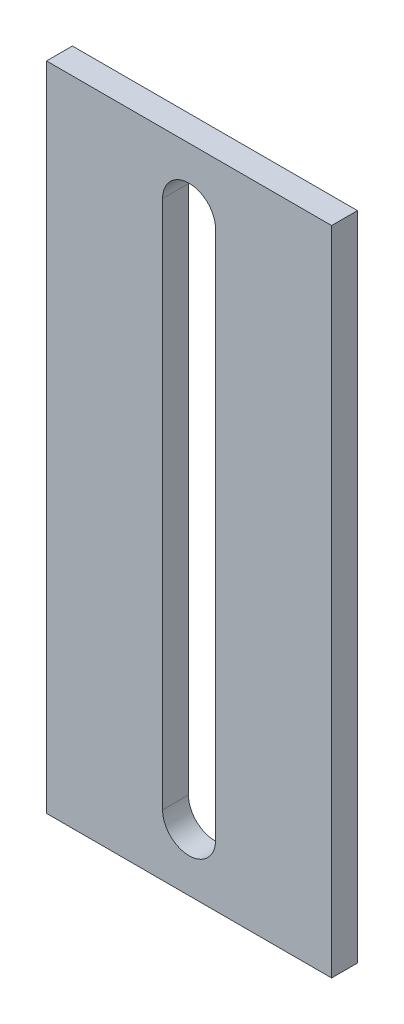
ISO-10303-21;
HEADER;
FILE_DESCRIPTION(('STEP AP214'),'2;1');
FILE_NAME('part.step','',(''),(''),'','','');
FILE_SCHEMA(('AUTOMOTIVE_DESIGN { 1 0 10303 214 1 1 1 1 }'));
ENDSEC;
DATA;
#1=APPLICATION_CONTEXT('core data for automotive mechanical design processes');
#2=APPLICATION_PROTOCOL_DEFINITION('international standard','automotive_design',2000,#1);
#3=PRODUCT_CONTEXT('',#1,'mechanical');
#4=PRODUCT('Part','Part','',(#3));
#5=PRODUCT_RELATED_PRODUCT_CATEGORY('part','',(#4));
#6=PRODUCT_DEFINITION_FORMATION('','',#4);
#7=PRODUCT_DEFINITION_CONTEXT('part definition',#1,'design');
#8=PRODUCT_DEFINITION('design','',#6,#7);
#9=PRODUCT_DEFINITION_SHAPE('','',#8);
#10=(LENGTH_UNIT() NAMED_UNIT(*) SI_UNIT(.MILLI.,.METRE.));
#11=(NAMED_UNIT(*) PLANE_ANGLE_UNIT() SI_UNIT($,.RADIAN.));
#12=(NAMED_UNIT(*) SI_UNIT($,.STERADIAN.) SOLID_ANGLE_UNIT());
#13=UNCERTAINTY_MEASURE_WITH_UNIT(LENGTH_MEASURE(1.E-05),#10,'distance_accuracy_value','');
#14=(GEOMETRIC_REPRESENTATION_CONTEXT(3) GLOBAL_UNCERTAINTY_ASSIGNED_CONTEXT((#13)) GLOBAL_UNIT_ASSIGNED_CONTEXT((#10,
#11,#12)) REPRESENTATION_CONTEXT('',''));
#15=CARTESIAN_POINT('',(0.,0.,0.));
#16=DIRECTION('',(0.,0.,1.));
#17=DIRECTION('',(1.,0.,0.));
#18=AXIS2_PLACEMENT_3D('',#15,#16,#17);
#19=CARTESIAN_POINT('',(0.,0.,6.35));
#20=DIRECTION('',(0.,0.,1.));
#21=DIRECTION('',(1.,0.,0.));
#22=AXIS2_PLACEMENT_3D('',#19,#20,#21);
#23=PLANE('',#22);
#24=DIRECTION('',(0.,-1.,0.));
#25=VECTOR('',#24,1.);
#26=CARTESIAN_POINT('',(-35.,-80.,6.35));
#27=LINE('',#26,#25);
#28=CARTESIAN_POINT('',(-35.,80.,6.35));
#29=VERTEX_POINT('',#28);
#30=CARTESIAN_POINT('',(-35.,-80.,6.35));
#31=VERTEX_POINT('',#30);
#32=EDGE_CURVE('E134',#29,#31,#27,.T.);
#33=ORIENTED_EDGE('',*,*,#32,.T.);
#34=DIRECTION('',(1.,0.,0.));
#35=VECTOR('',#34,1.);
#36=CARTESIAN_POINT('',(35.,-80.,6.35));
#37=LINE('',#36,#35);
#38=CARTESIAN_POINT('',(35.,-80.,6.35));
#39=VERTEX_POINT('',#38);
#40=EDGE_CURVE('E137',#31,#39,#37,.T.);
#41=ORIENTED_EDGE('',*,*,#40,.T.);
#42=DIRECTION('',(0.,1.,0.));
#43=VECTOR('',#42,1.);
#44=CARTESIAN_POINT('',(35.,-80.,6.35));
#45=LINE('',#44,#43);
#46=CARTESIAN_POINT('',(35.,80.,6.35));
#47=VERTEX_POINT('',#46);
#48=EDGE_CURVE('E140',#39,#47,#45,.T.);
#49=ORIENTED_EDGE('',*,*,#48,.T.);
#50=DIRECTION('',(-1.,0.,0.));
#51=VECTOR('',#50,1.);
#52=CARTESIAN_POINT('',(35.,80.,6.35));
#53=LINE('',#52,#51);
#54=EDGE_CURVE('E142',#47,#29,#53,.T.);
#55=ORIENTED_EDGE('',*,*,#54,.T.);
#56=EDGE_LOOP('',(#33,#41,#49,#55));
#57=FACE_BOUND('',#56,.T.);
#58=DIRECTION('',(0.,1.,0.));
#59=VECTOR('',#58,1.);
#60=CARTESIAN_POINT('',(6.50000000000002,-65.,6.35));
#61=LINE('',#60,#59);
#62=CARTESIAN_POINT('',(6.50000000000002,-65.,6.35));
#63=VERTEX_POINT('',#62);
#64=CARTESIAN_POINT('',(6.49999999999999,65.,6.35));
#65=VERTEX_POINT('',#64);
#66=EDGE_CURVE('E106',#63,#65,#61,.T.);
#67=ORIENTED_EDGE('',*,*,#66,.F.);
#68=CARTESIAN_POINT('',(0.,-65.,6.35));
#69=DIRECTION('',(0.,0.,1.));
#70=DIRECTION('',(1.,0.,0.));
#71=AXIS2_PLACEMENT_3D('',#68,#69,#70);
#72=CIRCLE('',#71,6.5);
#73=CARTESIAN_POINT('',(-6.49999999999998,-65.,6.35));
#74=VERTEX_POINT('',#73);
#75=EDGE_CURVE('E98',#74,#63,#72,.T.);
#76=ORIENTED_EDGE('',*,*,#75,.F.);
#77=DIRECTION('',(0.,-1.,0.));
#78=VECTOR('',#77,1.);
#79=CARTESIAN_POINT('',(-6.49999999999998,-65.,6.35));
#80=LINE('',#79,#78);
#81=CARTESIAN_POINT('',(-6.50000000000001,65.,6.35));
#82=VERTEX_POINT('',#81);
#83=EDGE_CURVE('E120',#82,#74,#80,.T.);
#84=ORIENTED_EDGE('',*,*,#83,.F.);
#85=CARTESIAN_POINT('',(0.,65.,6.35));
#86=DIRECTION('',(0.,0.,1.));
#87=DIRECTION('',(1.,0.,0.));
#88=AXIS2_PLACEMENT_3D('',#85,#86,#87);
#89=CIRCLE('',#88,6.5);
#90=EDGE_CURVE('E118',#65,#82,#89,.T.);
#91=ORIENTED_EDGE('',*,*,#90,.F.);
#92=EDGE_LOOP('',(#67,#76,#84,#91));
#93=FACE_BOUND('',#92,.T.);
#94=ADVANCED_FACE('F33',(#57,#93),#23,.T.);
#95=CARTESIAN_POINT('',(0.,0.,0.));
#96=DIRECTION('',(0.,0.,1.));
#97=DIRECTION('',(1.,0.,0.));
#98=AXIS2_PLACEMENT_3D('',#95,#96,#97);
#99=PLANE('',#98);
#100=DIRECTION('',(0.,-1.,0.));
#101=VECTOR('',#100,1.);
#102=CARTESIAN_POINT('',(-35.,-80.,0.));
#103=LINE('',#102,#101);
#104=CARTESIAN_POINT('',(-35.,80.,0.));
#105=VERTEX_POINT('',#104);
#106=CARTESIAN_POINT('',(-35.,-80.,0.));
#107=VERTEX_POINT('',#106);
#108=EDGE_CURVE('E114',#105,#107,#103,.T.);
#109=ORIENTED_EDGE('',*,*,#108,.F.);
#110=DIRECTION('',(-1.,0.,0.));
#111=VECTOR('',#110,1.);
#112=CARTESIAN_POINT('',(35.,80.,0.));
#113=LINE('',#112,#111);
#114=CARTESIAN_POINT('',(35.,80.,0.));
#115=VERTEX_POINT('',#114);
#116=EDGE_CURVE('E138',#115,#105,#113,.T.);
#117=ORIENTED_EDGE('',*,*,#116,.F.);
#118=DIRECTION('',(0.,1.,0.));
#119=VECTOR('',#118,1.);
#120=CARTESIAN_POINT('',(35.,-80.,0.));
#121=LINE('',#120,#119);
#122=CARTESIAN_POINT('',(35.,-80.,0.));
#123=VERTEX_POINT('',#122);
#124=EDGE_CURVE('E149',#123,#115,#121,.T.);
#125=ORIENTED_EDGE('',*,*,#124,.F.);
#126=DIRECTION('',(1.,0.,0.));
#127=VECTOR('',#126,1.);
#128=CARTESIAN_POINT('',(35.,-80.,0.));
#129=LINE('',#128,#127);
#130=EDGE_CURVE('E147',#107,#123,#129,.T.);
#131=ORIENTED_EDGE('',*,*,#130,.F.);
#132=EDGE_LOOP('',(#109,#117,#125,#131));
#133=FACE_BOUND('',#132,.T.);
#134=CARTESIAN_POINT('',(0.,-65.,0.));
#135=DIRECTION('',(0.,0.,1.));
#136=DIRECTION('',(1.,0.,0.));
#137=AXIS2_PLACEMENT_3D('',#134,#135,#136);
#138=CIRCLE('',#137,6.5);
#139=CARTESIAN_POINT('',(-6.49999999999998,-65.,0.));
#140=VERTEX_POINT('',#139);
#141=CARTESIAN_POINT('',(6.50000000000002,-65.,0.));
#142=VERTEX_POINT('',#141);
#143=EDGE_CURVE('E56',#140,#142,#138,.T.);
#144=ORIENTED_EDGE('',*,*,#143,.T.);
#145=DIRECTION('',(0.,1.,0.));
#146=VECTOR('',#145,1.);
#147=CARTESIAN_POINT('',(6.50000000000002,-65.,0.));
#148=LINE('',#147,#146);
#149=CARTESIAN_POINT('',(6.49999999999999,65.,0.));
#150=VERTEX_POINT('',#149);
#151=EDGE_CURVE('E113',#142,#150,#148,.T.);
#152=ORIENTED_EDGE('',*,*,#151,.T.);
#153=CARTESIAN_POINT('',(0.,65.,0.));
#154=DIRECTION('',(0.,0.,1.));
#155=DIRECTION('',(1.,0.,0.));
#156=AXIS2_PLACEMENT_3D('',#153,#154,#155);
#157=CIRCLE('',#156,6.5);
#158=CARTESIAN_POINT('',(-6.50000000000001,65.,0.));
#159=VERTEX_POINT('',#158);
#160=EDGE_CURVE('E126',#150,#159,#157,.T.);
#161=ORIENTED_EDGE('',*,*,#160,.T.);
#162=DIRECTION('',(0.,-1.,0.));
#163=VECTOR('',#162,1.);
#164=CARTESIAN_POINT('',(-6.49999999999998,-65.,0.));
#165=LINE('',#164,#163);
#166=EDGE_CURVE('E107',#159,#140,#165,.T.);
#167=ORIENTED_EDGE('',*,*,#166,.T.);
#168=EDGE_LOOP('',(#144,#152,#161,#167));
#169=FACE_BOUND('',#168,.T.);
#170=ADVANCED_FACE('F167',(#133,#169),#99,.F.);
#171=CARTESIAN_POINT('',(-35.,-80.,6.35));
#172=DIRECTION('',(1.,0.,0.));
#173=DIRECTION('',(0.,1.,0.));
#174=AXIS2_PLACEMENT_3D('',#171,#172,#173);
#175=PLANE('',#174);
#176=ORIENTED_EDGE('',*,*,#108,.T.);
#177=DIRECTION('',(0.,0.,-1.));
#178=VECTOR('',#177,1.);
#179=CARTESIAN_POINT('',(-35.,-80.,6.35));
#180=LINE('',#179,#178);
#181=EDGE_CURVE('E11',#31,#107,#180,.T.);
#182=ORIENTED_EDGE('',*,*,#181,.F.);
#183=ORIENTED_EDGE('',*,*,#32,.F.);
#184=DIRECTION('',(0.,0.,-1.));
#185=VECTOR('',#184,1.);
#186=CARTESIAN_POINT('',(-35.,80.,6.35));
#187=LINE('',#186,#185);
#188=EDGE_CURVE('E144',#29,#105,#187,.T.);
#189=ORIENTED_EDGE('',*,*,#188,.T.);
#190=EDGE_LOOP('',(#176,#182,#183,#189));
#191=FACE_BOUND('',#190,.T.);
#192=ADVANCED_FACE('F35',(#191),#175,.F.);
#193=CARTESIAN_POINT('',(35.,-80.,6.35));
#194=DIRECTION('',(0.,1.,0.));
#195=DIRECTION('',(-1.,0.,0.));
#196=AXIS2_PLACEMENT_3D('',#193,#194,#195);
#197=PLANE('',#196);
#198=ORIENTED_EDGE('',*,*,#130,.T.);
#199=DIRECTION('',(0.,0.,-1.));
#200=VECTOR('',#199,1.);
#201=CARTESIAN_POINT('',(35.,-80.,6.35));
#202=LINE('',#201,#200);
#203=EDGE_CURVE('E41',#39,#123,#202,.T.);
#204=ORIENTED_EDGE('',*,*,#203,.F.);
#205=ORIENTED_EDGE('',*,*,#40,.F.);
#206=ORIENTED_EDGE('',*,*,#181,.T.);
#207=EDGE_LOOP('',(#198,#204,#205,#206));
#208=FACE_BOUND('',#207,.T.);
#209=ADVANCED_FACE('F177',(#208),#197,.F.);
#210=CARTESIAN_POINT('',(35.,-80.,6.35));
#211=DIRECTION('',(-1.,0.,0.));
#212=DIRECTION('',(0.,0.,1.));
#213=AXIS2_PLACEMENT_3D('',#210,#211,#212);
#214=PLANE('',#213);
#215=ORIENTED_EDGE('',*,*,#124,.T.);
#216=DIRECTION('',(0.,0.,-1.));
#217=VECTOR('',#216,1.);
#218=CARTESIAN_POINT('',(35.,80.,6.35));
#219=LINE('',#218,#217);
#220=EDGE_CURVE('E154',#47,#115,#219,.T.);
#221=ORIENTED_EDGE('',*,*,#220,.F.);
#222=ORIENTED_EDGE('',*,*,#48,.F.);
#223=ORIENTED_EDGE('',*,*,#203,.T.);
#224=EDGE_LOOP('',(#215,#221,#222,#223));
#225=FACE_BOUND('',#224,.T.);
#226=ADVANCED_FACE('F161',(#225),#214,.F.);
#227=CARTESIAN_POINT('',(35.,80.,6.35));
#228=DIRECTION('',(0.,-1.,0.));
#229=DIRECTION('',(1.,0.,0.));
#230=AXIS2_PLACEMENT_3D('',#227,#228,#229);
#231=PLANE('',#230);
#232=ORIENTED_EDGE('',*,*,#116,.T.);
#233=ORIENTED_EDGE('',*,*,#188,.F.);
#234=ORIENTED_EDGE('',*,*,#54,.F.);
#235=ORIENTED_EDGE('',*,*,#220,.T.);
#236=EDGE_LOOP('',(#232,#233,#234,#235));
#237=FACE_BOUND('',#236,.T.);
#238=ADVANCED_FACE('F171',(#237),#231,.F.);
#239=CARTESIAN_POINT('',(0.,-65.,6.35));
#240=DIRECTION('',(0.,0.,-1.));
#241=DIRECTION('',(-1.,0.,0.));
#242=AXIS2_PLACEMENT_3D('',#239,#240,#241);
#243=CYLINDRICAL_SURFACE('',#242,6.5);
#244=ORIENTED_EDGE('',*,*,#143,.F.);
#245=DIRECTION('',(0.,0.,-1.));
#246=VECTOR('',#245,1.);
#247=CARTESIAN_POINT('',(-6.49999999999998,-65.,6.35));
#248=LINE('',#247,#246);
#249=EDGE_CURVE('E102',#74,#140,#248,.T.);
#250=ORIENTED_EDGE('',*,*,#249,.F.);
#251=ORIENTED_EDGE('',*,*,#75,.T.);
#252=DIRECTION('',(0.,0.,-1.));
#253=VECTOR('',#252,1.);
#254=CARTESIAN_POINT('',(6.50000000000002,-65.,6.35));
#255=LINE('',#254,#253);
#256=EDGE_CURVE('E101',#63,#142,#255,.T.);
#257=ORIENTED_EDGE('',*,*,#256,.T.);
#258=EDGE_LOOP('',(#244,#250,#251,#257));
#259=FACE_BOUND('',#258,.T.);
#260=ADVANCED_FACE('F100',(#259),#243,.F.);
#261=CARTESIAN_POINT('',(6.50000000000002,-65.,6.35));
#262=DIRECTION('',(-1.,0.,0.));
#263=DIRECTION('',(0.,-1.,0.));
#264=AXIS2_PLACEMENT_3D('',#261,#262,#263);
#265=PLANE('',#264);
#266=ORIENTED_EDGE('',*,*,#151,.F.);
#267=ORIENTED_EDGE('',*,*,#256,.F.);
#268=ORIENTED_EDGE('',*,*,#66,.T.);
#269=DIRECTION('',(0.,0.,-1.));
#270=VECTOR('',#269,1.);
#271=CARTESIAN_POINT('',(6.49999999999999,65.,6.35));
#272=LINE('',#271,#270);
#273=EDGE_CURVE('E115',#65,#150,#272,.T.);
#274=ORIENTED_EDGE('',*,*,#273,.T.);
#275=EDGE_LOOP('',(#266,#267,#268,#274));
#276=FACE_BOUND('',#275,.T.);
#277=ADVANCED_FACE('F110',(#276),#265,.T.);
#278=CARTESIAN_POINT('',(0.,65.,6.35));
#279=DIRECTION('',(0.,0.,-1.));
#280=DIRECTION('',(-1.,0.,0.));
#281=AXIS2_PLACEMENT_3D('',#278,#279,#280);
#282=CYLINDRICAL_SURFACE('',#281,6.5);
#283=ORIENTED_EDGE('',*,*,#160,.F.);
#284=ORIENTED_EDGE('',*,*,#273,.F.);
#285=ORIENTED_EDGE('',*,*,#90,.T.);
#286=DIRECTION('',(0.,0.,-1.));
#287=VECTOR('',#286,1.);
#288=CARTESIAN_POINT('',(-6.50000000000001,65.,6.35));
#289=LINE('',#288,#287);
#290=EDGE_CURVE('E48',#82,#159,#289,.T.);
#291=ORIENTED_EDGE('',*,*,#290,.T.);
#292=EDGE_LOOP('',(#283,#284,#285,#291));
#293=FACE_BOUND('',#292,.T.);
#294=ADVANCED_FACE('F200',(#293),#282,.F.);
#295=CARTESIAN_POINT('',(-6.49999999999998,-65.,6.35));
#296=DIRECTION('',(1.,0.,0.));
#297=DIRECTION('',(0.,1.,0.));
#298=AXIS2_PLACEMENT_3D('',#295,#296,#297);
#299=PLANE('',#298);
#300=ORIENTED_EDGE('',*,*,#166,.F.);
#301=ORIENTED_EDGE('',*,*,#290,.F.);
#302=ORIENTED_EDGE('',*,*,#83,.T.);
#303=ORIENTED_EDGE('',*,*,#249,.T.);
#304=EDGE_LOOP('',(#300,#301,#302,#303));
#305=FACE_BOUND('',#304,.T.);
#306=ADVANCED_FACE('F204',(#305),#299,.T.);
#307=CLOSED_SHELL('',(#94,#170,#192,#209,#226,#238,#260,#277,#294,#306));
#308=MANIFOLD_SOLID_BREP('B2',#307);
#309=ADVANCED_BREP_SHAPE_REPRESENTATION('',(#18,#308),#14);
#310=SHAPE_DEFINITION_REPRESENTATION(#9,#309);
ENDSEC;
END-ISO-10303-21;
